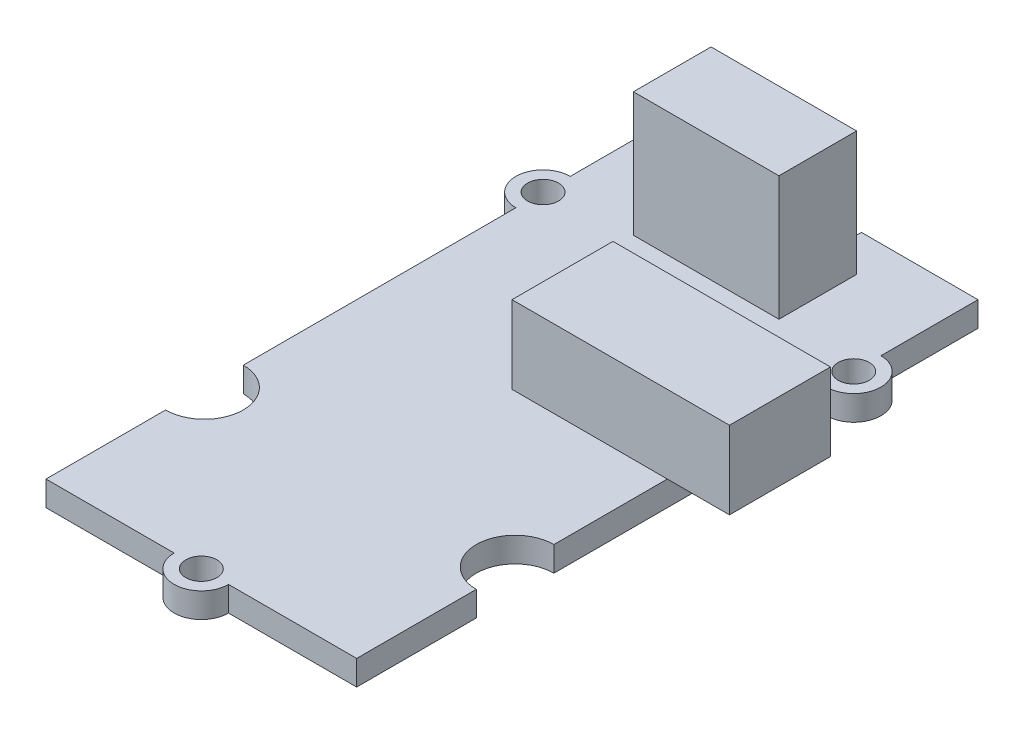
ISO-10303-21;
HEADER;
FILE_DESCRIPTION(('STEP AP214'),'2;1');
FILE_NAME('part.step','',(''),(''),'','','');
FILE_SCHEMA(('AUTOMOTIVE_DESIGN { 1 0 10303 214 1 1 1 1 }'));
ENDSEC;
DATA;
#1=APPLICATION_CONTEXT('core data for automotive mechanical design processes');
#2=APPLICATION_PROTOCOL_DEFINITION('international standard','automotive_design',2000,#1);
#3=PRODUCT_CONTEXT('',#1,'mechanical');
#4=PRODUCT('Part','Part','',(#3));
#5=PRODUCT_RELATED_PRODUCT_CATEGORY('part','',(#4));
#6=PRODUCT_DEFINITION_FORMATION('','',#4);
#7=PRODUCT_DEFINITION_CONTEXT('part definition',#1,'design');
#8=PRODUCT_DEFINITION('design','',#6,#7);
#9=PRODUCT_DEFINITION_SHAPE('','',#8);
#10=(LENGTH_UNIT() NAMED_UNIT(*) SI_UNIT(.MILLI.,.METRE.));
#11=(NAMED_UNIT(*) PLANE_ANGLE_UNIT() SI_UNIT($,.RADIAN.));
#12=(NAMED_UNIT(*) SI_UNIT($,.STERADIAN.) SOLID_ANGLE_UNIT());
#13=UNCERTAINTY_MEASURE_WITH_UNIT(LENGTH_MEASURE(1.E-05),#10,'distance_accuracy_value','');
#14=(GEOMETRIC_REPRESENTATION_CONTEXT(3) GLOBAL_UNCERTAINTY_ASSIGNED_CONTEXT((#13)) GLOBAL_UNIT_ASSIGNED_CONTEXT((#10,
#11,#12)) REPRESENTATION_CONTEXT('',''));
#15=CARTESIAN_POINT('',(0.,0.,0.));
#16=DIRECTION('',(0.,0.,1.));
#17=DIRECTION('',(1.,0.,0.));
#18=AXIS2_PLACEMENT_3D('',#15,#16,#17);
#19=CARTESIAN_POINT('',(0.,1.6,0.));
#20=DIRECTION('',(0.,1.,0.));
#21=DIRECTION('',(0.,0.,1.));
#22=AXIS2_PLACEMENT_3D('',#19,#20,#21);
#23=PLANE('',#22);
#24=CARTESIAN_POINT('',(-10.,1.6,-12.));
#25=DIRECTION('',(0.,1.,0.));
#26=DIRECTION('',(0.,0.,1.));
#27=AXIS2_PLACEMENT_3D('',#24,#25,#26);
#28=CIRCLE('',#27,0.999999999999999);
#29=CARTESIAN_POINT('',(-10.,1.6,-11.));
#30=VERTEX_POINT('',#29);
#31=EDGE_CURVE('E313',#30,#30,#28,.F.);
#32=ORIENTED_EDGE('',*,*,#31,.T.);
#33=EDGE_LOOP('',(#32));
#34=FACE_BOUND('',#33,.T.);
#35=CARTESIAN_POINT('',(0.,1.6,20.));
#36=DIRECTION('',(0.,1.,0.));
#37=DIRECTION('',(0.,0.,1.));
#38=AXIS2_PLACEMENT_3D('',#35,#36,#37);
#39=CIRCLE('',#38,1.);
#40=CARTESIAN_POINT('',(0.,1.6,21.));
#41=VERTEX_POINT('',#40);
#42=EDGE_CURVE('E316',#41,#41,#39,.T.);
#43=ORIENTED_EDGE('',*,*,#42,.F.);
#44=EDGE_LOOP('',(#43));
#45=FACE_BOUND('',#44,.T.);
#46=CARTESIAN_POINT('',(10.,1.6,-12.));
#47=DIRECTION('',(0.,1.,0.));
#48=DIRECTION('',(0.,0.,1.));
#49=AXIS2_PLACEMENT_3D('',#46,#47,#48);
#50=CIRCLE('',#49,0.999999999999999);
#51=CARTESIAN_POINT('',(10.,1.6,-11.));
#52=VERTEX_POINT('',#51);
#53=EDGE_CURVE('E319',#52,#52,#50,.T.);
#54=ORIENTED_EDGE('',*,*,#53,.F.);
#55=EDGE_LOOP('',(#54));
#56=FACE_BOUND('',#55,.T.);
#57=DIRECTION('',(0.,0.,1.));
#58=VECTOR('',#57,1.);
#59=CARTESIAN_POINT('',(4.68451791319812,1.6,0.));
#60=LINE('',#59,#58);
#61=CARTESIAN_POINT('',(4.68451791319812,1.6,-17.5));
#62=VERTEX_POINT('',#61);
#63=CARTESIAN_POINT('',(4.68451791319812,1.6,-12.5));
#64=VERTEX_POINT('',#63);
#65=EDGE_CURVE('E236',#62,#64,#60,.T.);
#66=ORIENTED_EDGE('',*,*,#65,.T.);
#67=DIRECTION('',(1.,0.,0.));
#68=VECTOR('',#67,1.);
#69=CARTESIAN_POINT('',(0.,1.6,-12.5));
#70=LINE('',#69,#68);
#71=CARTESIAN_POINT('',(-4.68451791319812,1.6,-12.5));
#72=VERTEX_POINT('',#71);
#73=EDGE_CURVE('E222',#72,#64,#70,.T.);
#74=ORIENTED_EDGE('',*,*,#73,.F.);
#75=DIRECTION('',(0.,0.,1.));
#76=VECTOR('',#75,1.);
#77=CARTESIAN_POINT('',(-4.68451791319811,1.6,0.));
#78=LINE('',#77,#76);
#79=CARTESIAN_POINT('',(-4.68451791319812,1.6,-17.5));
#80=VERTEX_POINT('',#79);
#81=EDGE_CURVE('E216',#80,#72,#78,.T.);
#82=ORIENTED_EDGE('',*,*,#81,.F.);
#83=DIRECTION('',(1.,0.,0.));
#84=VECTOR('',#83,1.);
#85=CARTESIAN_POINT('',(0.,1.6,-17.5));
#86=LINE('',#85,#84);
#87=CARTESIAN_POINT('',(0.,1.6,-17.5));
#88=VERTEX_POINT('',#87);
#89=EDGE_CURVE('E50',#80,#88,#86,.T.);
#90=ORIENTED_EDGE('',*,*,#89,.T.);
#91=CARTESIAN_POINT('',(0.,1.6,-20.));
#92=DIRECTION('',(0.,1.,0.));
#93=DIRECTION('',(0.,0.,1.));
#94=AXIS2_PLACEMENT_3D('',#91,#92,#93);
#95=CIRCLE('',#94,2.5);
#96=CARTESIAN_POINT('',(-2.5,1.6,-20.));
#97=VERTEX_POINT('',#96);
#98=EDGE_CURVE('E310',#97,#88,#95,.T.);
#99=ORIENTED_EDGE('',*,*,#98,.F.);
#100=DIRECTION('',(1.,0.,0.));
#101=VECTOR('',#100,1.);
#102=CARTESIAN_POINT('',(0.,1.6,-20.));
#103=LINE('',#102,#101);
#104=CARTESIAN_POINT('',(-10.,1.6,-20.));
#105=VERTEX_POINT('',#104);
#106=EDGE_CURVE('E309',#105,#97,#103,.T.);
#107=ORIENTED_EDGE('',*,*,#106,.F.);
#108=DIRECTION('',(0.,0.,-1.));
#109=VECTOR('',#108,1.);
#110=CARTESIAN_POINT('',(-10.,1.6,0.));
#111=LINE('',#110,#109);
#112=CARTESIAN_POINT('',(-10.,1.6,-13.75));
#113=VERTEX_POINT('',#112);
#114=EDGE_CURVE('E279',#113,#105,#111,.T.);
#115=ORIENTED_EDGE('',*,*,#114,.F.);
#116=CARTESIAN_POINT('',(-10.,1.6,-12.));
#117=DIRECTION('',(0.,1.,0.));
#118=DIRECTION('',(0.,0.,1.));
#119=AXIS2_PLACEMENT_3D('',#116,#117,#118);
#120=CIRCLE('',#119,1.75);
#121=CARTESIAN_POINT('',(-10.,1.6,-10.25));
#122=VERTEX_POINT('',#121);
#123=EDGE_CURVE('E282',#122,#113,#120,.F.);
#124=ORIENTED_EDGE('',*,*,#123,.F.);
#125=CARTESIAN_POINT('',(-10.,1.6,7.3));
#126=VERTEX_POINT('',#125);
#127=EDGE_CURVE('E285',#126,#122,#111,.T.);
#128=ORIENTED_EDGE('',*,*,#127,.F.);
#129=CARTESIAN_POINT('',(-10.,1.6,9.8));
#130=DIRECTION('',(0.,1.,0.));
#131=DIRECTION('',(0.,0.,1.));
#132=AXIS2_PLACEMENT_3D('',#129,#130,#131);
#133=CIRCLE('',#132,2.5);
#134=CARTESIAN_POINT('',(-10.,1.6,12.3));
#135=VERTEX_POINT('',#134);
#136=EDGE_CURVE('E288',#126,#135,#133,.F.);
#137=ORIENTED_EDGE('',*,*,#136,.T.);
#138=CARTESIAN_POINT('',(-10.,1.6,20.));
#139=VERTEX_POINT('',#138);
#140=EDGE_CURVE('E284',#139,#135,#111,.T.);
#141=ORIENTED_EDGE('',*,*,#140,.F.);
#142=DIRECTION('',(1.,0.,0.));
#143=VECTOR('',#142,1.);
#144=CARTESIAN_POINT('',(0.,1.6,20.));
#145=LINE('',#144,#143);
#146=CARTESIAN_POINT('',(-1.75,1.6,20.));
#147=VERTEX_POINT('',#146);
#148=EDGE_CURVE('E290',#139,#147,#145,.T.);
#149=ORIENTED_EDGE('',*,*,#148,.T.);
#150=CARTESIAN_POINT('',(0.,1.6,20.));
#151=DIRECTION('',(0.,1.,0.));
#152=DIRECTION('',(0.,0.,1.));
#153=AXIS2_PLACEMENT_3D('',#150,#151,#152);
#154=CIRCLE('',#153,1.75);
#155=CARTESIAN_POINT('',(1.75,1.6,20.));
#156=VERTEX_POINT('',#155);
#157=EDGE_CURVE('E292',#147,#156,#154,.T.);
#158=ORIENTED_EDGE('',*,*,#157,.T.);
#159=CARTESIAN_POINT('',(10.,1.6,20.));
#160=VERTEX_POINT('',#159);
#161=EDGE_CURVE('E293',#156,#160,#145,.T.);
#162=ORIENTED_EDGE('',*,*,#161,.T.);
#163=DIRECTION('',(0.,0.,-1.));
#164=VECTOR('',#163,1.);
#165=CARTESIAN_POINT('',(10.,1.6,0.));
#166=LINE('',#165,#164);
#167=CARTESIAN_POINT('',(10.,1.6,12.3));
#168=VERTEX_POINT('',#167);
#169=EDGE_CURVE('E295',#160,#168,#166,.T.);
#170=ORIENTED_EDGE('',*,*,#169,.T.);
#171=CARTESIAN_POINT('',(10.,1.6,9.8));
#172=DIRECTION('',(0.,1.,0.));
#173=DIRECTION('',(0.,0.,1.));
#174=AXIS2_PLACEMENT_3D('',#171,#172,#173);
#175=CIRCLE('',#174,2.5);
#176=CARTESIAN_POINT('',(10.,1.6,7.3));
#177=VERTEX_POINT('',#176);
#178=EDGE_CURVE('E297',#177,#168,#175,.T.);
#179=ORIENTED_EDGE('',*,*,#178,.F.);
#180=CARTESIAN_POINT('',(10.,1.6,0.));
#181=VERTEX_POINT('',#180);
#182=EDGE_CURVE('E299',#177,#181,#166,.T.);
#183=ORIENTED_EDGE('',*,*,#182,.T.);
#184=DIRECTION('',(1.,0.,0.));
#185=VECTOR('',#184,1.);
#186=CARTESIAN_POINT('',(0.,1.6,0.));
#187=LINE('',#186,#185);
#188=CARTESIAN_POINT('',(0.,1.6,0.));
#189=VERTEX_POINT('',#188);
#190=EDGE_CURVE('E260',#189,#181,#187,.T.);
#191=ORIENTED_EDGE('',*,*,#190,.F.);
#192=DIRECTION('',(0.,0.,1.));
#193=VECTOR('',#192,1.);
#194=CARTESIAN_POINT('',(0.,1.6,0.));
#195=LINE('',#194,#193);
#196=CARTESIAN_POINT('',(0.,1.6,-6.5));
#197=VERTEX_POINT('',#196);
#198=EDGE_CURVE('E58',#197,#189,#195,.T.);
#199=ORIENTED_EDGE('',*,*,#198,.F.);
#200=DIRECTION('',(1.,0.,0.));
#201=VECTOR('',#200,1.);
#202=CARTESIAN_POINT('',(0.,1.6,-6.5));
#203=LINE('',#202,#201);
#204=CARTESIAN_POINT('',(10.,1.6,-6.5));
#205=VERTEX_POINT('',#204);
#206=EDGE_CURVE('E249',#197,#205,#203,.T.);
#207=ORIENTED_EDGE('',*,*,#206,.T.);
#208=CARTESIAN_POINT('',(10.,1.6,-10.25));
#209=VERTEX_POINT('',#208);
#210=EDGE_CURVE('E298',#205,#209,#166,.T.);
#211=ORIENTED_EDGE('',*,*,#210,.T.);
#212=CARTESIAN_POINT('',(10.,1.6,-12.));
#213=DIRECTION('',(0.,1.,0.));
#214=DIRECTION('',(0.,0.,1.));
#215=AXIS2_PLACEMENT_3D('',#212,#213,#214);
#216=CIRCLE('',#215,1.75);
#217=CARTESIAN_POINT('',(10.,1.6,-13.75));
#218=VERTEX_POINT('',#217);
#219=EDGE_CURVE('E302',#209,#218,#216,.T.);
#220=ORIENTED_EDGE('',*,*,#219,.T.);
#221=CARTESIAN_POINT('',(10.,1.6,-20.));
#222=VERTEX_POINT('',#221);
#223=EDGE_CURVE('E304',#218,#222,#166,.T.);
#224=ORIENTED_EDGE('',*,*,#223,.T.);
#225=CARTESIAN_POINT('',(2.5,1.6,-20.));
#226=VERTEX_POINT('',#225);
#227=EDGE_CURVE('E305',#226,#222,#103,.T.);
#228=ORIENTED_EDGE('',*,*,#227,.F.);
#229=EDGE_CURVE('E308',#88,#226,#95,.T.);
#230=ORIENTED_EDGE('',*,*,#229,.F.);
#231=EDGE_CURVE('E238',#88,#62,#86,.T.);
#232=ORIENTED_EDGE('',*,*,#231,.T.);
#233=EDGE_LOOP('',(#66,#74,#82,#90,#99,#107,#115,#124,#128,#137,#141,#149,#158,#162,#170,#179,
#183,#191,#199,#207,#211,#220,#224,#228,#230,#232));
#234=FACE_BOUND('',#233,.T.);
#235=ADVANCED_FACE('F35',(#34,#45,#56,#234),#23,.T.);
#236=CARTESIAN_POINT('',(-10.,1.6,0.));
#237=DIRECTION('',(-1.,0.,0.));
#238=DIRECTION('',(0.,0.,1.));
#239=AXIS2_PLACEMENT_3D('',#236,#237,#238);
#240=PLANE('',#239);
#241=DIRECTION('',(0.,0.,-1.));
#242=VECTOR('',#241,1.);
#243=CARTESIAN_POINT('',(-10.,0.,0.));
#244=LINE('',#243,#242);
#245=CARTESIAN_POINT('',(-10.,0.,-13.75));
#246=VERTEX_POINT('',#245);
#247=CARTESIAN_POINT('',(-10.,0.,-20.));
#248=VERTEX_POINT('',#247);
#249=EDGE_CURVE('E278',#246,#248,#244,.T.);
#250=ORIENTED_EDGE('',*,*,#249,.F.);
#251=DIRECTION('',(0.,-1.,0.));
#252=VECTOR('',#251,1.);
#253=CARTESIAN_POINT('',(-10.,1.6,-13.75));
#254=LINE('',#253,#252);
#255=EDGE_CURVE('E11',#113,#246,#254,.T.);
#256=ORIENTED_EDGE('',*,*,#255,.F.);
#257=ORIENTED_EDGE('',*,*,#114,.T.);
#258=DIRECTION('',(0.,-1.,0.));
#259=VECTOR('',#258,1.);
#260=CARTESIAN_POINT('',(-10.,1.6,-20.));
#261=LINE('',#260,#259);
#262=EDGE_CURVE('E322',#105,#248,#261,.T.);
#263=ORIENTED_EDGE('',*,*,#262,.T.);
#264=EDGE_LOOP('',(#250,#256,#257,#263));
#265=FACE_BOUND('',#264,.T.);
#266=ADVANCED_FACE('F426',(#265),#240,.T.);
#267=CARTESIAN_POINT('',(-10.,1.6,-12.));
#268=DIRECTION('',(0.,-1.,0.));
#269=DIRECTION('',(0.,0.,-1.));
#270=AXIS2_PLACEMENT_3D('',#267,#268,#269);
#271=CYLINDRICAL_SURFACE('',#270,1.75);
#272=CARTESIAN_POINT('',(-10.,0.,-12.));
#273=DIRECTION('',(0.,1.,0.));
#274=DIRECTION('',(0.,0.,1.));
#275=AXIS2_PLACEMENT_3D('',#272,#273,#274);
#276=CIRCLE('',#275,1.75);
#277=CARTESIAN_POINT('',(-10.,0.,-10.25));
#278=VERTEX_POINT('',#277);
#279=EDGE_CURVE('E325',#278,#246,#276,.F.);
#280=ORIENTED_EDGE('',*,*,#279,.F.);
#281=DIRECTION('',(0.,-1.,0.));
#282=VECTOR('',#281,1.);
#283=CARTESIAN_POINT('',(-10.,1.6,-10.25));
#284=LINE('',#283,#282);
#285=EDGE_CURVE('E43',#122,#278,#284,.T.);
#286=ORIENTED_EDGE('',*,*,#285,.F.);
#287=ORIENTED_EDGE('',*,*,#123,.T.);
#288=ORIENTED_EDGE('',*,*,#255,.T.);
#289=EDGE_LOOP('',(#280,#286,#287,#288));
#290=FACE_BOUND('',#289,.T.);
#291=ADVANCED_FACE('F37',(#290),#271,.T.);
#292=CARTESIAN_POINT('',(-10.,0.,7.3));
#293=VERTEX_POINT('',#292);
#294=EDGE_CURVE('E327',#293,#278,#244,.T.);
#295=ORIENTED_EDGE('',*,*,#294,.F.);
#296=DIRECTION('',(0.,-1.,0.));
#297=VECTOR('',#296,1.);
#298=CARTESIAN_POINT('',(-10.,1.6,7.3));
#299=LINE('',#298,#297);
#300=EDGE_CURVE('E393',#126,#293,#299,.T.);
#301=ORIENTED_EDGE('',*,*,#300,.F.);
#302=ORIENTED_EDGE('',*,*,#127,.T.);
#303=ORIENTED_EDGE('',*,*,#285,.T.);
#304=EDGE_LOOP('',(#295,#301,#302,#303));
#305=FACE_BOUND('',#304,.T.);
#306=ADVANCED_FACE('F398',(#305),#240,.T.);
#307=CARTESIAN_POINT('',(-10.,1.6,9.8));
#308=DIRECTION('',(0.,-1.,0.));
#309=DIRECTION('',(0.,0.,-1.));
#310=AXIS2_PLACEMENT_3D('',#307,#308,#309);
#311=CYLINDRICAL_SURFACE('',#310,2.5);
#312=CARTESIAN_POINT('',(-10.,0.,9.8));
#313=DIRECTION('',(0.,1.,0.));
#314=DIRECTION('',(0.,0.,1.));
#315=AXIS2_PLACEMENT_3D('',#312,#313,#314);
#316=CIRCLE('',#315,2.5);
#317=CARTESIAN_POINT('',(-10.,0.,12.3));
#318=VERTEX_POINT('',#317);
#319=EDGE_CURVE('E330',#293,#318,#316,.F.);
#320=ORIENTED_EDGE('',*,*,#319,.T.);
#321=DIRECTION('',(0.,-1.,0.));
#322=VECTOR('',#321,1.);
#323=CARTESIAN_POINT('',(-10.,1.6,12.3));
#324=LINE('',#323,#322);
#325=EDGE_CURVE('E391',#135,#318,#324,.T.);
#326=ORIENTED_EDGE('',*,*,#325,.F.);
#327=ORIENTED_EDGE('',*,*,#136,.F.);
#328=ORIENTED_EDGE('',*,*,#300,.T.);
#329=EDGE_LOOP('',(#320,#326,#327,#328));
#330=FACE_BOUND('',#329,.T.);
#331=ADVANCED_FACE('F420',(#330),#311,.F.);
#332=CARTESIAN_POINT('',(-10.,0.,20.));
#333=VERTEX_POINT('',#332);
#334=EDGE_CURVE('E326',#333,#318,#244,.T.);
#335=ORIENTED_EDGE('',*,*,#334,.F.);
#336=DIRECTION('',(0.,-1.,0.));
#337=VECTOR('',#336,1.);
#338=CARTESIAN_POINT('',(-10.,1.6,20.));
#339=LINE('',#338,#337);
#340=EDGE_CURVE('E389',#139,#333,#339,.T.);
#341=ORIENTED_EDGE('',*,*,#340,.F.);
#342=ORIENTED_EDGE('',*,*,#140,.T.);
#343=ORIENTED_EDGE('',*,*,#325,.T.);
#344=EDGE_LOOP('',(#335,#341,#342,#343));
#345=FACE_BOUND('',#344,.T.);
#346=ADVANCED_FACE('F413',(#345),#240,.T.);
#347=CARTESIAN_POINT('',(0.,1.6,20.));
#348=DIRECTION('',(0.,0.,-1.));
#349=DIRECTION('',(-1.,0.,0.));
#350=AXIS2_PLACEMENT_3D('',#347,#348,#349);
#351=PLANE('',#350);
#352=DIRECTION('',(1.,0.,0.));
#353=VECTOR('',#352,1.);
#354=CARTESIAN_POINT('',(0.,0.,20.));
#355=LINE('',#354,#353);
#356=CARTESIAN_POINT('',(-1.75,0.,20.));
#357=VERTEX_POINT('',#356);
#358=EDGE_CURVE('E333',#333,#357,#355,.T.);
#359=ORIENTED_EDGE('',*,*,#358,.T.);
#360=DIRECTION('',(0.,-1.,0.));
#361=VECTOR('',#360,1.);
#362=CARTESIAN_POINT('',(-1.75,1.6,20.));
#363=LINE('',#362,#361);
#364=EDGE_CURVE('E386',#147,#357,#363,.T.);
#365=ORIENTED_EDGE('',*,*,#364,.F.);
#366=ORIENTED_EDGE('',*,*,#148,.F.);
#367=ORIENTED_EDGE('',*,*,#340,.T.);
#368=EDGE_LOOP('',(#359,#365,#366,#367));
#369=FACE_BOUND('',#368,.T.);
#370=ADVANCED_FACE('F535',(#369),#351,.F.);
#371=CARTESIAN_POINT('',(0.,1.6,20.));
#372=DIRECTION('',(0.,-1.,0.));
#373=DIRECTION('',(0.,0.,-1.));
#374=AXIS2_PLACEMENT_3D('',#371,#372,#373);
#375=CYLINDRICAL_SURFACE('',#374,1.75);
#376=CARTESIAN_POINT('',(0.,0.,20.));
#377=DIRECTION('',(0.,1.,0.));
#378=DIRECTION('',(0.,0.,1.));
#379=AXIS2_PLACEMENT_3D('',#376,#377,#378);
#380=CIRCLE('',#379,1.75);
#381=CARTESIAN_POINT('',(1.75,0.,20.));
#382=VERTEX_POINT('',#381);
#383=EDGE_CURVE('E335',#357,#382,#380,.T.);
#384=ORIENTED_EDGE('',*,*,#383,.T.);
#385=DIRECTION('',(0.,-1.,0.));
#386=VECTOR('',#385,1.);
#387=CARTESIAN_POINT('',(1.75,1.6,20.));
#388=LINE('',#387,#386);
#389=EDGE_CURVE('E383',#156,#382,#388,.T.);
#390=ORIENTED_EDGE('',*,*,#389,.F.);
#391=ORIENTED_EDGE('',*,*,#157,.F.);
#392=ORIENTED_EDGE('',*,*,#364,.T.);
#393=EDGE_LOOP('',(#384,#390,#391,#392));
#394=FACE_BOUND('',#393,.T.);
#395=ADVANCED_FACE('F533',(#394),#375,.T.);
#396=CARTESIAN_POINT('',(10.,0.,20.));
#397=VERTEX_POINT('',#396);
#398=EDGE_CURVE('E336',#382,#397,#355,.T.);
#399=ORIENTED_EDGE('',*,*,#398,.T.);
#400=DIRECTION('',(0.,-1.,0.));
#401=VECTOR('',#400,1.);
#402=CARTESIAN_POINT('',(10.,1.6,20.));
#403=LINE('',#402,#401);
#404=EDGE_CURVE('E380',#160,#397,#403,.T.);
#405=ORIENTED_EDGE('',*,*,#404,.F.);
#406=ORIENTED_EDGE('',*,*,#161,.F.);
#407=ORIENTED_EDGE('',*,*,#389,.T.);
#408=EDGE_LOOP('',(#399,#405,#406,#407));
#409=FACE_BOUND('',#408,.T.);
#410=ADVANCED_FACE('F530',(#409),#351,.F.);
#411=CARTESIAN_POINT('',(10.,1.6,0.));
#412=DIRECTION('',(-1.,0.,0.));
#413=DIRECTION('',(0.,0.,1.));
#414=AXIS2_PLACEMENT_3D('',#411,#412,#413);
#415=PLANE('',#414);
#416=DIRECTION('',(0.,0.,-1.));
#417=VECTOR('',#416,1.);
#418=CARTESIAN_POINT('',(10.,0.,0.));
#419=LINE('',#418,#417);
#420=CARTESIAN_POINT('',(10.,0.,12.3));
#421=VERTEX_POINT('',#420);
#422=EDGE_CURVE('E338',#397,#421,#419,.T.);
#423=ORIENTED_EDGE('',*,*,#422,.T.);
#424=DIRECTION('',(0.,-1.,0.));
#425=VECTOR('',#424,1.);
#426=CARTESIAN_POINT('',(10.,1.6,12.3));
#427=LINE('',#426,#425);
#428=EDGE_CURVE('E378',#168,#421,#427,.T.);
#429=ORIENTED_EDGE('',*,*,#428,.F.);
#430=ORIENTED_EDGE('',*,*,#169,.F.);
#431=ORIENTED_EDGE('',*,*,#404,.T.);
#432=EDGE_LOOP('',(#423,#429,#430,#431));
#433=FACE_BOUND('',#432,.T.);
#434=ADVANCED_FACE('F523',(#433),#415,.F.);
#435=CARTESIAN_POINT('',(10.,1.6,9.8));
#436=DIRECTION('',(0.,-1.,0.));
#437=DIRECTION('',(0.,0.,-1.));
#438=AXIS2_PLACEMENT_3D('',#435,#436,#437);
#439=CYLINDRICAL_SURFACE('',#438,2.5);
#440=CARTESIAN_POINT('',(10.,0.,9.8));
#441=DIRECTION('',(0.,1.,0.));
#442=DIRECTION('',(0.,0.,1.));
#443=AXIS2_PLACEMENT_3D('',#440,#441,#442);
#444=CIRCLE('',#443,2.5);
#445=CARTESIAN_POINT('',(10.,0.,7.3));
#446=VERTEX_POINT('',#445);
#447=EDGE_CURVE('E341',#446,#421,#444,.T.);
#448=ORIENTED_EDGE('',*,*,#447,.F.);
#449=DIRECTION('',(0.,-1.,0.));
#450=VECTOR('',#449,1.);
#451=CARTESIAN_POINT('',(10.,1.6,7.3));
#452=LINE('',#451,#450);
#453=EDGE_CURVE('E376',#177,#446,#452,.T.);
#454=ORIENTED_EDGE('',*,*,#453,.F.);
#455=ORIENTED_EDGE('',*,*,#178,.T.);
#456=ORIENTED_EDGE('',*,*,#428,.T.);
#457=EDGE_LOOP('',(#448,#454,#455,#456));
#458=FACE_BOUND('',#457,.T.);
#459=ADVANCED_FACE('F526',(#458),#439,.F.);
#460=CARTESIAN_POINT('',(10.,0.,-10.25));
#461=VERTEX_POINT('',#460);
#462=EDGE_CURVE('E343',#446,#461,#419,.T.);
#463=ORIENTED_EDGE('',*,*,#462,.T.);
#464=DIRECTION('',(0.,-1.,0.));
#465=VECTOR('',#464,1.);
#466=CARTESIAN_POINT('',(10.,1.6,-10.25));
#467=LINE('',#466,#465);
#468=EDGE_CURVE('E373',#209,#461,#467,.T.);
#469=ORIENTED_EDGE('',*,*,#468,.F.);
#470=ORIENTED_EDGE('',*,*,#210,.F.);
#471=EDGE_CURVE('E460',#181,#205,#166,.T.);
#472=ORIENTED_EDGE('',*,*,#471,.F.);
#473=ORIENTED_EDGE('',*,*,#182,.F.);
#474=ORIENTED_EDGE('',*,*,#453,.T.);
#475=EDGE_LOOP('',(#463,#469,#470,#472,#473,#474));
#476=FACE_BOUND('',#475,.T.);
#477=ADVANCED_FACE('F450',(#476),#415,.F.);
#478=CARTESIAN_POINT('',(10.,1.6,-12.));
#479=DIRECTION('',(0.,-1.,0.));
#480=DIRECTION('',(0.,0.,-1.));
#481=AXIS2_PLACEMENT_3D('',#478,#479,#480);
#482=CYLINDRICAL_SURFACE('',#481,1.75);
#483=CARTESIAN_POINT('',(10.,0.,-12.));
#484=DIRECTION('',(0.,1.,0.));
#485=DIRECTION('',(0.,0.,1.));
#486=AXIS2_PLACEMENT_3D('',#483,#484,#485);
#487=CIRCLE('',#486,1.75);
#488=CARTESIAN_POINT('',(10.,0.,-13.75));
#489=VERTEX_POINT('',#488);
#490=EDGE_CURVE('E346',#461,#489,#487,.T.);
#491=ORIENTED_EDGE('',*,*,#490,.T.);
#492=DIRECTION('',(0.,-1.,0.));
#493=VECTOR('',#492,1.);
#494=CARTESIAN_POINT('',(10.,1.6,-13.75));
#495=LINE('',#494,#493);
#496=EDGE_CURVE('E370',#218,#489,#495,.T.);
#497=ORIENTED_EDGE('',*,*,#496,.F.);
#498=ORIENTED_EDGE('',*,*,#219,.F.);
#499=ORIENTED_EDGE('',*,*,#468,.T.);
#500=EDGE_LOOP('',(#491,#497,#498,#499));
#501=FACE_BOUND('',#500,.T.);
#502=ADVANCED_FACE('F456',(#501),#482,.T.);
#503=CARTESIAN_POINT('',(10.,0.,-20.));
#504=VERTEX_POINT('',#503);
#505=EDGE_CURVE('E342',#489,#504,#419,.T.);
#506=ORIENTED_EDGE('',*,*,#505,.T.);
#507=DIRECTION('',(0.,-1.,0.));
#508=VECTOR('',#507,1.);
#509=CARTESIAN_POINT('',(10.,1.6,-20.));
#510=LINE('',#509,#508);
#511=EDGE_CURVE('E368',#222,#504,#510,.T.);
#512=ORIENTED_EDGE('',*,*,#511,.F.);
#513=ORIENTED_EDGE('',*,*,#223,.F.);
#514=ORIENTED_EDGE('',*,*,#496,.T.);
#515=EDGE_LOOP('',(#506,#512,#513,#514));
#516=FACE_BOUND('',#515,.T.);
#517=ADVANCED_FACE('F445',(#516),#415,.F.);
#518=CARTESIAN_POINT('',(0.,1.6,-20.));
#519=DIRECTION('',(0.,0.,-1.));
#520=DIRECTION('',(-1.,0.,0.));
#521=AXIS2_PLACEMENT_3D('',#518,#519,#520);
#522=PLANE('',#521);
#523=DIRECTION('',(1.,0.,0.));
#524=VECTOR('',#523,1.);
#525=CARTESIAN_POINT('',(0.,0.,-20.));
#526=LINE('',#525,#524);
#527=CARTESIAN_POINT('',(2.5,0.,-20.));
#528=VERTEX_POINT('',#527);
#529=EDGE_CURVE('E348',#528,#504,#526,.T.);
#530=ORIENTED_EDGE('',*,*,#529,.F.);
#531=DIRECTION('',(0.,-1.,0.));
#532=VECTOR('',#531,1.);
#533=CARTESIAN_POINT('',(2.5,1.6,-20.));
#534=LINE('',#533,#532);
#535=EDGE_CURVE('E366',#226,#528,#534,.T.);
#536=ORIENTED_EDGE('',*,*,#535,.F.);
#537=ORIENTED_EDGE('',*,*,#227,.T.);
#538=ORIENTED_EDGE('',*,*,#511,.T.);
#539=EDGE_LOOP('',(#530,#536,#537,#538));
#540=FACE_BOUND('',#539,.T.);
#541=ADVANCED_FACE('F440',(#540),#522,.T.);
#542=CARTESIAN_POINT('',(0.,1.6,-20.));
#543=DIRECTION('',(0.,-1.,0.));
#544=DIRECTION('',(0.,0.,-1.));
#545=AXIS2_PLACEMENT_3D('',#542,#543,#544);
#546=CYLINDRICAL_SURFACE('',#545,2.5);
#547=CARTESIAN_POINT('',(0.,0.,-20.));
#548=DIRECTION('',(0.,1.,0.));
#549=DIRECTION('',(0.,0.,1.));
#550=AXIS2_PLACEMENT_3D('',#547,#548,#549);
#551=CIRCLE('',#550,2.5);
#552=CARTESIAN_POINT('',(-2.5,0.,-20.));
#553=VERTEX_POINT('',#552);
#554=EDGE_CURVE('E351',#553,#528,#551,.T.);
#555=ORIENTED_EDGE('',*,*,#554,.F.);
#556=DIRECTION('',(0.,-1.,0.));
#557=VECTOR('',#556,1.);
#558=CARTESIAN_POINT('',(-2.5,1.6,-20.));
#559=LINE('',#558,#557);
#560=EDGE_CURVE('E364',#97,#553,#559,.T.);
#561=ORIENTED_EDGE('',*,*,#560,.F.);
#562=ORIENTED_EDGE('',*,*,#98,.T.);
#563=ORIENTED_EDGE('',*,*,#229,.T.);
#564=ORIENTED_EDGE('',*,*,#535,.T.);
#565=EDGE_LOOP('',(#555,#561,#562,#563,#564));
#566=FACE_BOUND('',#565,.T.);
#567=ADVANCED_FACE('F433',(#566),#546,.F.);
#568=CARTESIAN_POINT('',(0.,1.6,20.));
#569=DIRECTION('',(0.,-1.,0.));
#570=DIRECTION('',(0.,0.,-1.));
#571=AXIS2_PLACEMENT_3D('',#568,#569,#570);
#572=CYLINDRICAL_SURFACE('',#571,1.);
#573=ORIENTED_EDGE('',*,*,#42,.T.);
#574=EDGE_LOOP('',(#573));
#575=FACE_BOUND('',#574,.T.);
#576=CARTESIAN_POINT('',(0.,0.,20.));
#577=DIRECTION('',(0.,1.,0.));
#578=DIRECTION('',(0.,0.,1.));
#579=AXIS2_PLACEMENT_3D('',#576,#577,#578);
#580=CIRCLE('',#579,1.);
#581=CARTESIAN_POINT('',(0.,0.,21.));
#582=VERTEX_POINT('',#581);
#583=EDGE_CURVE('E358',#582,#582,#580,.T.);
#584=ORIENTED_EDGE('',*,*,#583,.F.);
#585=EDGE_LOOP('',(#584));
#586=FACE_BOUND('',#585,.T.);
#587=ADVANCED_FACE('F510',(#575,#586),#572,.F.);
#588=CARTESIAN_POINT('',(-10.,1.6,-12.));
#589=DIRECTION('',(0.,-1.,0.));
#590=DIRECTION('',(0.,0.,-1.));
#591=AXIS2_PLACEMENT_3D('',#588,#589,#590);
#592=CYLINDRICAL_SURFACE('',#591,0.999999999999999);
#593=ORIENTED_EDGE('',*,*,#31,.F.);
#594=EDGE_LOOP('',(#593));
#595=FACE_BOUND('',#594,.T.);
#596=CARTESIAN_POINT('',(-10.,0.,-12.));
#597=DIRECTION('',(0.,1.,0.));
#598=DIRECTION('',(0.,0.,1.));
#599=AXIS2_PLACEMENT_3D('',#596,#597,#598);
#600=CIRCLE('',#599,0.999999999999999);
#601=CARTESIAN_POINT('',(-10.,0.,-11.));
#602=VERTEX_POINT('',#601);
#603=EDGE_CURVE('E355',#602,#602,#600,.F.);
#604=ORIENTED_EDGE('',*,*,#603,.T.);
#605=EDGE_LOOP('',(#604));
#606=FACE_BOUND('',#605,.T.);
#607=ADVANCED_FACE('F513',(#595,#606),#592,.F.);
#608=EDGE_CURVE('E352',#248,#553,#526,.T.);
#609=ORIENTED_EDGE('',*,*,#608,.F.);
#610=ORIENTED_EDGE('',*,*,#262,.F.);
#611=ORIENTED_EDGE('',*,*,#106,.T.);
#612=ORIENTED_EDGE('',*,*,#560,.T.);
#613=EDGE_LOOP('',(#609,#610,#611,#612));
#614=FACE_BOUND('',#613,.T.);
#615=ADVANCED_FACE('F430',(#614),#522,.T.);
#616=CARTESIAN_POINT('',(10.,1.6,-12.));
#617=DIRECTION('',(0.,-1.,0.));
#618=DIRECTION('',(0.,0.,-1.));
#619=AXIS2_PLACEMENT_3D('',#616,#617,#618);
#620=CYLINDRICAL_SURFACE('',#619,0.999999999999999);
#621=ORIENTED_EDGE('',*,*,#53,.T.);
#622=EDGE_LOOP('',(#621));
#623=FACE_BOUND('',#622,.T.);
#624=CARTESIAN_POINT('',(10.,0.,-12.));
#625=DIRECTION('',(0.,1.,0.));
#626=DIRECTION('',(0.,0.,1.));
#627=AXIS2_PLACEMENT_3D('',#624,#625,#626);
#628=CIRCLE('',#627,0.999999999999999);
#629=CARTESIAN_POINT('',(10.,0.,-11.));
#630=VERTEX_POINT('',#629);
#631=EDGE_CURVE('E283',#630,#630,#628,.T.);
#632=ORIENTED_EDGE('',*,*,#631,.F.);
#633=EDGE_LOOP('',(#632));
#634=FACE_BOUND('',#633,.T.);
#635=ADVANCED_FACE('F506',(#623,#634),#620,.F.);
#636=CARTESIAN_POINT('',(0.,0.,0.));
#637=DIRECTION('',(0.,1.,0.));
#638=DIRECTION('',(0.,0.,1.));
#639=AXIS2_PLACEMENT_3D('',#636,#637,#638);
#640=PLANE('',#639);
#641=ORIENTED_EDGE('',*,*,#249,.T.);
#642=ORIENTED_EDGE('',*,*,#608,.T.);
#643=ORIENTED_EDGE('',*,*,#554,.T.);
#644=ORIENTED_EDGE('',*,*,#529,.T.);
#645=ORIENTED_EDGE('',*,*,#505,.F.);
#646=ORIENTED_EDGE('',*,*,#490,.F.);
#647=ORIENTED_EDGE('',*,*,#462,.F.);
#648=ORIENTED_EDGE('',*,*,#447,.T.);
#649=ORIENTED_EDGE('',*,*,#422,.F.);
#650=ORIENTED_EDGE('',*,*,#398,.F.);
#651=ORIENTED_EDGE('',*,*,#383,.F.);
#652=ORIENTED_EDGE('',*,*,#358,.F.);
#653=ORIENTED_EDGE('',*,*,#334,.T.);
#654=ORIENTED_EDGE('',*,*,#319,.F.);
#655=ORIENTED_EDGE('',*,*,#294,.T.);
#656=ORIENTED_EDGE('',*,*,#279,.T.);
#657=EDGE_LOOP('',(#641,#642,#643,#644,#645,#646,#647,#648,#649,#650,#651,#652,#653,#654,#655,#656));
#658=FACE_BOUND('',#657,.T.);
#659=ORIENTED_EDGE('',*,*,#603,.F.);
#660=EDGE_LOOP('',(#659));
#661=FACE_BOUND('',#660,.T.);
#662=ORIENTED_EDGE('',*,*,#583,.T.);
#663=EDGE_LOOP('',(#662));
#664=FACE_BOUND('',#663,.T.);
#665=ORIENTED_EDGE('',*,*,#631,.T.);
#666=EDGE_LOOP('',(#665));
#667=FACE_BOUND('',#666,.T.);
#668=ADVANCED_FACE('F406',(#658,#661,#664,#667),#640,.F.);
#669=CARTESIAN_POINT('',(0.,1.6,0.));
#670=DIRECTION('',(0.,1.,0.));
#671=DIRECTION('',(0.,0.,1.));
#672=AXIS2_PLACEMENT_3D('',#669,#670,#671);
#673=PLANE('',#672);
#674=CARTESIAN_POINT('',(14.,1.6,0.));
#675=VERTEX_POINT('',#674);
#676=EDGE_CURVE('E259',#181,#675,#187,.T.);
#677=ORIENTED_EDGE('',*,*,#676,.F.);
#678=ORIENTED_EDGE('',*,*,#471,.T.);
#679=CARTESIAN_POINT('',(14.,1.6,-6.5));
#680=VERTEX_POINT('',#679);
#681=EDGE_CURVE('E266',#205,#680,#203,.T.);
#682=ORIENTED_EDGE('',*,*,#681,.T.);
#683=DIRECTION('',(0.,0.,1.));
#684=VECTOR('',#683,1.);
#685=CARTESIAN_POINT('',(14.,1.6,0.));
#686=LINE('',#685,#684);
#687=EDGE_CURVE('E263',#680,#675,#686,.T.);
#688=ORIENTED_EDGE('',*,*,#687,.T.);
#689=EDGE_LOOP('',(#677,#678,#682,#688));
#690=FACE_BOUND('',#689,.T.);
#691=ADVANCED_FACE('F465',(#690),#673,.F.);
#692=CARTESIAN_POINT('',(0.,6.6,0.));
#693=DIRECTION('',(1.,0.,0.));
#694=DIRECTION('',(0.,0.,-1.));
#695=AXIS2_PLACEMENT_3D('',#692,#693,#694);
#696=PLANE('',#695);
#697=ORIENTED_EDGE('',*,*,#198,.T.);
#698=DIRECTION('',(0.,-1.,0.));
#699=VECTOR('',#698,1.);
#700=CARTESIAN_POINT('',(0.,6.6,0.));
#701=LINE('',#700,#699);
#702=CARTESIAN_POINT('',(0.,6.6,0.));
#703=VERTEX_POINT('',#702);
#704=EDGE_CURVE('E275',#703,#189,#701,.T.);
#705=ORIENTED_EDGE('',*,*,#704,.F.);
#706=DIRECTION('',(0.,0.,1.));
#707=VECTOR('',#706,1.);
#708=CARTESIAN_POINT('',(0.,6.6,0.));
#709=LINE('',#708,#707);
#710=CARTESIAN_POINT('',(0.,6.6,-6.5));
#711=VERTEX_POINT('',#710);
#712=EDGE_CURVE('E245',#711,#703,#709,.T.);
#713=ORIENTED_EDGE('',*,*,#712,.F.);
#714=DIRECTION('',(0.,-1.,0.));
#715=VECTOR('',#714,1.);
#716=CARTESIAN_POINT('',(0.,6.6,-6.5));
#717=LINE('',#716,#715);
#718=EDGE_CURVE('E257',#711,#197,#717,.T.);
#719=ORIENTED_EDGE('',*,*,#718,.T.);
#720=EDGE_LOOP('',(#697,#705,#713,#719));
#721=FACE_BOUND('',#720,.T.);
#722=ADVANCED_FACE('F473',(#721),#696,.F.);
#723=CARTESIAN_POINT('',(0.,6.6,0.));
#724=DIRECTION('',(0.,0.,-1.));
#725=DIRECTION('',(-1.,0.,0.));
#726=AXIS2_PLACEMENT_3D('',#723,#724,#725);
#727=PLANE('',#726);
#728=ORIENTED_EDGE('',*,*,#190,.T.);
#729=ORIENTED_EDGE('',*,*,#676,.T.);
#730=DIRECTION('',(0.,-1.,0.));
#731=VECTOR('',#730,1.);
#732=CARTESIAN_POINT('',(14.,6.6,0.));
#733=LINE('',#732,#731);
#734=CARTESIAN_POINT('',(14.,6.6,0.));
#735=VERTEX_POINT('',#734);
#736=EDGE_CURVE('E272',#735,#675,#733,.T.);
#737=ORIENTED_EDGE('',*,*,#736,.F.);
#738=DIRECTION('',(1.,0.,0.));
#739=VECTOR('',#738,1.);
#740=CARTESIAN_POINT('',(0.,6.6,0.));
#741=LINE('',#740,#739);
#742=EDGE_CURVE('E248',#703,#735,#741,.T.);
#743=ORIENTED_EDGE('',*,*,#742,.F.);
#744=ORIENTED_EDGE('',*,*,#704,.T.);
#745=EDGE_LOOP('',(#728,#729,#737,#743,#744));
#746=FACE_BOUND('',#745,.T.);
#747=ADVANCED_FACE('F469',(#746),#727,.F.);
#748=CARTESIAN_POINT('',(14.,6.6,0.));
#749=DIRECTION('',(1.,0.,0.));
#750=DIRECTION('',(0.,0.,-1.));
#751=AXIS2_PLACEMENT_3D('',#748,#749,#750);
#752=PLANE('',#751);
#753=ORIENTED_EDGE('',*,*,#687,.F.);
#754=DIRECTION('',(0.,-1.,0.));
#755=VECTOR('',#754,1.);
#756=CARTESIAN_POINT('',(14.,6.6,-6.5));
#757=LINE('',#756,#755);
#758=CARTESIAN_POINT('',(14.,6.6,-6.5));
#759=VERTEX_POINT('',#758);
#760=EDGE_CURVE('E269',#759,#680,#757,.T.);
#761=ORIENTED_EDGE('',*,*,#760,.F.);
#762=DIRECTION('',(0.,0.,1.));
#763=VECTOR('',#762,1.);
#764=CARTESIAN_POINT('',(14.,6.6,0.));
#765=LINE('',#764,#763);
#766=EDGE_CURVE('E251',#759,#735,#765,.T.);
#767=ORIENTED_EDGE('',*,*,#766,.T.);
#768=ORIENTED_EDGE('',*,*,#736,.T.);
#769=EDGE_LOOP('',(#753,#761,#767,#768));
#770=FACE_BOUND('',#769,.T.);
#771=ADVANCED_FACE('F479',(#770),#752,.T.);
#772=CARTESIAN_POINT('',(0.,6.6,-6.5));
#773=DIRECTION('',(0.,0.,-1.));
#774=DIRECTION('',(-1.,0.,0.));
#775=AXIS2_PLACEMENT_3D('',#772,#773,#774);
#776=PLANE('',#775);
#777=ORIENTED_EDGE('',*,*,#206,.F.);
#778=ORIENTED_EDGE('',*,*,#718,.F.);
#779=DIRECTION('',(1.,0.,0.));
#780=VECTOR('',#779,1.);
#781=CARTESIAN_POINT('',(0.,6.6,-6.5));
#782=LINE('',#781,#780);
#783=EDGE_CURVE('E254',#711,#759,#782,.T.);
#784=ORIENTED_EDGE('',*,*,#783,.T.);
#785=ORIENTED_EDGE('',*,*,#760,.T.);
#786=ORIENTED_EDGE('',*,*,#681,.F.);
#787=EDGE_LOOP('',(#777,#778,#784,#785,#786));
#788=FACE_BOUND('',#787,.T.);
#789=ADVANCED_FACE('F476',(#788),#776,.T.);
#790=CARTESIAN_POINT('',(0.,6.6,0.));
#791=DIRECTION('',(0.,1.,0.));
#792=DIRECTION('',(0.,0.,1.));
#793=AXIS2_PLACEMENT_3D('',#790,#791,#792);
#794=PLANE('',#793);
#795=ORIENTED_EDGE('',*,*,#712,.T.);
#796=ORIENTED_EDGE('',*,*,#742,.T.);
#797=ORIENTED_EDGE('',*,*,#766,.F.);
#798=ORIENTED_EDGE('',*,*,#783,.F.);
#799=EDGE_LOOP('',(#795,#796,#797,#798));
#800=FACE_BOUND('',#799,.T.);
#801=ADVANCED_FACE('F481',(#800),#794,.T.);
#802=CARTESIAN_POINT('',(0.,9.6,-12.5));
#803=DIRECTION('',(0.,0.,-1.));
#804=DIRECTION('',(-1.,0.,0.));
#805=AXIS2_PLACEMENT_3D('',#802,#803,#804);
#806=PLANE('',#805);
#807=ORIENTED_EDGE('',*,*,#73,.T.);
#808=DIRECTION('',(0.,-1.,0.));
#809=VECTOR('',#808,1.);
#810=CARTESIAN_POINT('',(4.68451791319812,9.6,-12.5));
#811=LINE('',#810,#809);
#812=CARTESIAN_POINT('',(4.68451791319812,9.6,-12.5));
#813=VERTEX_POINT('',#812);
#814=EDGE_CURVE('E219',#813,#64,#811,.T.);
#815=ORIENTED_EDGE('',*,*,#814,.F.);
#816=DIRECTION('',(1.,0.,0.));
#817=VECTOR('',#816,1.);
#818=CARTESIAN_POINT('',(0.,9.6,-12.5));
#819=LINE('',#818,#817);
#820=CARTESIAN_POINT('',(-4.68451791319812,9.6,-12.5));
#821=VERTEX_POINT('',#820);
#822=EDGE_CURVE('E204',#821,#813,#819,.T.);
#823=ORIENTED_EDGE('',*,*,#822,.F.);
#824=DIRECTION('',(0.,-1.,0.));
#825=VECTOR('',#824,1.);
#826=CARTESIAN_POINT('',(-4.68451791319812,9.6,-12.5));
#827=LINE('',#826,#825);
#828=EDGE_CURVE('E234',#821,#72,#827,.T.);
#829=ORIENTED_EDGE('',*,*,#828,.T.);
#830=EDGE_LOOP('',(#807,#815,#823,#829));
#831=FACE_BOUND('',#830,.T.);
#832=ADVANCED_FACE('F220',(#831),#806,.F.);
#833=CARTESIAN_POINT('',(4.68451791319812,9.6,0.));
#834=DIRECTION('',(1.,0.,0.));
#835=DIRECTION('',(0.,0.,-1.));
#836=AXIS2_PLACEMENT_3D('',#833,#834,#835);
#837=PLANE('',#836);
#838=ORIENTED_EDGE('',*,*,#65,.F.);
#839=DIRECTION('',(0.,-1.,0.));
#840=VECTOR('',#839,1.);
#841=CARTESIAN_POINT('',(4.68451791319812,9.6,-17.5));
#842=LINE('',#841,#840);
#843=CARTESIAN_POINT('',(4.68451791319812,9.6,-17.5));
#844=VERTEX_POINT('',#843);
#845=EDGE_CURVE('E226',#844,#62,#842,.T.);
#846=ORIENTED_EDGE('',*,*,#845,.F.);
#847=DIRECTION('',(0.,0.,1.));
#848=VECTOR('',#847,1.);
#849=CARTESIAN_POINT('',(4.68451791319812,9.6,0.));
#850=LINE('',#849,#848);
#851=EDGE_CURVE('E209',#844,#813,#850,.T.);
#852=ORIENTED_EDGE('',*,*,#851,.T.);
#853=ORIENTED_EDGE('',*,*,#814,.T.);
#854=EDGE_LOOP('',(#838,#846,#852,#853));
#855=FACE_BOUND('',#854,.T.);
#856=ADVANCED_FACE('F228',(#855),#837,.T.);
#857=CARTESIAN_POINT('',(0.,9.6,-17.5));
#858=DIRECTION('',(0.,0.,-1.));
#859=DIRECTION('',(-1.,0.,0.));
#860=AXIS2_PLACEMENT_3D('',#857,#858,#859);
#861=PLANE('',#860);
#862=ORIENTED_EDGE('',*,*,#89,.F.);
#863=DIRECTION('',(0.,-1.,0.));
#864=VECTOR('',#863,1.);
#865=CARTESIAN_POINT('',(-4.68451791319812,9.6,-17.5));
#866=LINE('',#865,#864);
#867=CARTESIAN_POINT('',(-4.68451791319812,9.6,-17.5));
#868=VERTEX_POINT('',#867);
#869=EDGE_CURVE('E242',#868,#80,#866,.T.);
#870=ORIENTED_EDGE('',*,*,#869,.F.);
#871=DIRECTION('',(1.,0.,0.));
#872=VECTOR('',#871,1.);
#873=CARTESIAN_POINT('',(0.,9.6,-17.5));
#874=LINE('',#873,#872);
#875=EDGE_CURVE('E229',#868,#844,#874,.T.);
#876=ORIENTED_EDGE('',*,*,#875,.T.);
#877=ORIENTED_EDGE('',*,*,#845,.T.);
#878=ORIENTED_EDGE('',*,*,#231,.F.);
#879=EDGE_LOOP('',(#862,#870,#876,#877,#878));
#880=FACE_BOUND('',#879,.T.);
#881=ADVANCED_FACE('F745',(#880),#861,.T.);
#882=CARTESIAN_POINT('',(-4.68451791319811,9.6,0.));
#883=DIRECTION('',(1.,0.,0.));
#884=DIRECTION('',(0.,0.,-1.));
#885=AXIS2_PLACEMENT_3D('',#882,#883,#884);
#886=PLANE('',#885);
#887=ORIENTED_EDGE('',*,*,#81,.T.);
#888=ORIENTED_EDGE('',*,*,#828,.F.);
#889=DIRECTION('',(0.,0.,1.));
#890=VECTOR('',#889,1.);
#891=CARTESIAN_POINT('',(-4.68451791319811,9.6,0.));
#892=LINE('',#891,#890);
#893=EDGE_CURVE('E212',#868,#821,#892,.T.);
#894=ORIENTED_EDGE('',*,*,#893,.F.);
#895=ORIENTED_EDGE('',*,*,#869,.T.);
#896=EDGE_LOOP('',(#887,#888,#894,#895));
#897=FACE_BOUND('',#896,.T.);
#898=ADVANCED_FACE('F753',(#897),#886,.F.);
#899=CARTESIAN_POINT('',(0.,9.6,0.));
#900=DIRECTION('',(0.,1.,0.));
#901=DIRECTION('',(0.,0.,1.));
#902=AXIS2_PLACEMENT_3D('',#899,#900,#901);
#903=PLANE('',#902);
#904=ORIENTED_EDGE('',*,*,#822,.T.);
#905=ORIENTED_EDGE('',*,*,#851,.F.);
#906=ORIENTED_EDGE('',*,*,#875,.F.);
#907=ORIENTED_EDGE('',*,*,#893,.T.);
#908=EDGE_LOOP('',(#904,#905,#906,#907));
#909=FACE_BOUND('',#908,.T.);
#910=ADVANCED_FACE('F206',(#909),#903,.T.);
#911=CLOSED_SHELL('',(#235,#266,#291,#306,#331,#346,#370,#395,#410,#434,#459,#477,#502,#517,
#541,#567,#587,#607,#615,#635,#668,#691,#722,#747,#771,#789,#801,#832,#856,#881,#898,#910));
#912=MANIFOLD_SOLID_BREP('B2',#911);
#913=ADVANCED_BREP_SHAPE_REPRESENTATION('',(#18,#912),#14);
#914=SHAPE_DEFINITION_REPRESENTATION(#9,#913);
ENDSEC;
END-ISO-10303-21;
